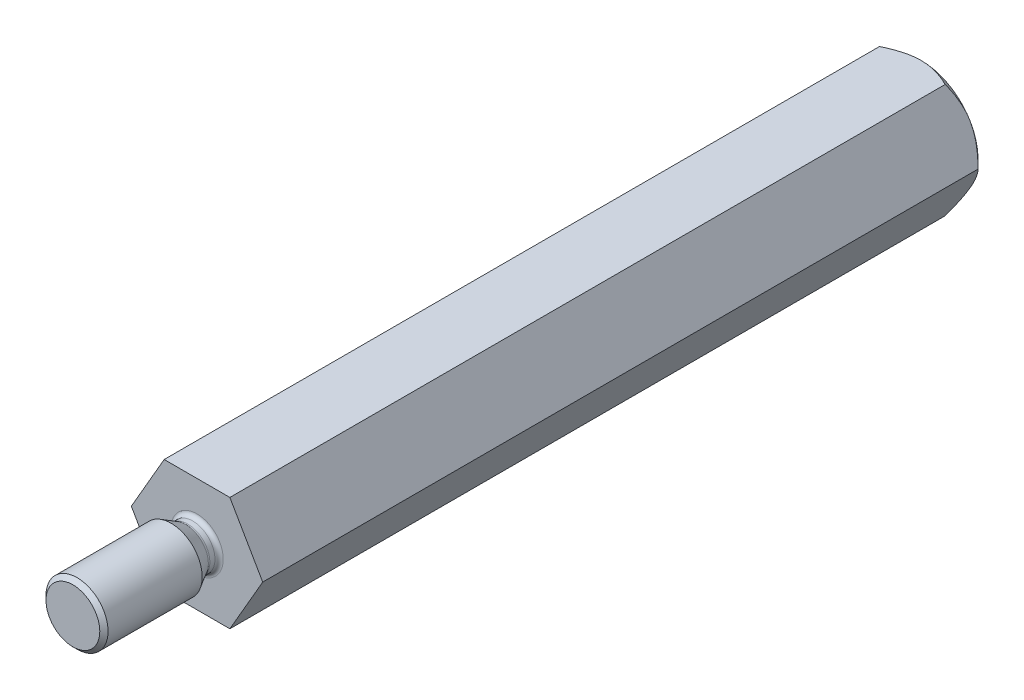
ISO-10303-21;
HEADER;
FILE_DESCRIPTION(('STEP AP214'),'2;1');
FILE_NAME('part.step','',(''),(''),'','','');
FILE_SCHEMA(('AUTOMOTIVE_DESIGN { 1 0 10303 214 1 1 1 1 }'));
ENDSEC;
DATA;
#1=APPLICATION_CONTEXT('core data for automotive mechanical design processes');
#2=APPLICATION_PROTOCOL_DEFINITION('international standard','automotive_design',2000,#1);
#3=PRODUCT_CONTEXT('',#1,'mechanical');
#4=PRODUCT('Part','Part','',(#3));
#5=PRODUCT_RELATED_PRODUCT_CATEGORY('part','',(#4));
#6=PRODUCT_DEFINITION_FORMATION('','',#4);
#7=PRODUCT_DEFINITION_CONTEXT('part definition',#1,'design');
#8=PRODUCT_DEFINITION('design','',#6,#7);
#9=PRODUCT_DEFINITION_SHAPE('','',#8);
#10=(LENGTH_UNIT() NAMED_UNIT(*) SI_UNIT(.MILLI.,.METRE.));
#11=(NAMED_UNIT(*) PLANE_ANGLE_UNIT() SI_UNIT($,.RADIAN.));
#12=(NAMED_UNIT(*) SI_UNIT($,.STERADIAN.) SOLID_ANGLE_UNIT());
#13=UNCERTAINTY_MEASURE_WITH_UNIT(LENGTH_MEASURE(1.E-05),#10,'distance_accuracy_value','');
#14=(GEOMETRIC_REPRESENTATION_CONTEXT(3) GLOBAL_UNCERTAINTY_ASSIGNED_CONTEXT((#13)) GLOBAL_UNIT_ASSIGNED_CONTEXT((#10,
#11,#12)) REPRESENTATION_CONTEXT('',''));
#15=CARTESIAN_POINT('',(0.,0.,0.));
#16=DIRECTION('',(0.,0.,1.));
#17=DIRECTION('',(1.,0.,0.));
#18=AXIS2_PLACEMENT_3D('',#15,#16,#17);
#19=CARTESIAN_POINT('',(0.,0.,0.));
#20=DIRECTION('',(0.,0.,-1.));
#21=DIRECTION('',(0.,1.,0.));
#22=AXIS2_PLACEMENT_3D('',#19,#20,#21);
#23=CYLINDRICAL_SURFACE('',#22,1.2295);
#24=CARTESIAN_POINT('',(0.,0.,7.75));
#25=DIRECTION('',(0.,0.,1.));
#26=DIRECTION('',(0.,-1.,0.));
#27=AXIS2_PLACEMENT_3D('',#24,#25,#26);
#28=CIRCLE('',#27,1.2295);
#29=CARTESIAN_POINT('',(0.,-1.2295,7.75));
#30=VERTEX_POINT('',#29);
#31=EDGE_CURVE('E10',#30,#30,#28,.T.);
#32=ORIENTED_EDGE('',*,*,#31,.T.);
#33=EDGE_LOOP('',(#32));
#34=FACE_BOUND('',#33,.T.);
#35=CARTESIAN_POINT('',(0.,0.,6.));
#36=DIRECTION('',(0.,0.,-1.));
#37=DIRECTION('',(0.,1.,0.));
#38=AXIS2_PLACEMENT_3D('',#35,#36,#37);
#39=CIRCLE('',#38,1.2295);
#40=CARTESIAN_POINT('',(0.,1.2295,6.));
#41=VERTEX_POINT('',#40);
#42=EDGE_CURVE('E427',#41,#41,#39,.T.);
#43=ORIENTED_EDGE('',*,*,#42,.T.);
#44=EDGE_LOOP('',(#43));
#45=FACE_BOUND('',#44,.T.);
#46=ADVANCED_FACE('F18',(#34,#45),#23,.F.);
#47=CARTESIAN_POINT('',(0.,0.,7.75));
#48=DIRECTION('',(0.,0.,-1.));
#49=DIRECTION('',(0.,-1.,0.));
#50=AXIS2_PLACEMENT_3D('',#47,#48,#49);
#51=CONICAL_SURFACE('',#50,1.2295,1.0297442587);
#52=CARTESIAN_POINT('',(0.,0.,8.48875813109439));
#53=VERTEX_POINT('',#52);
#54=VERTEX_LOOP('',#53);
#55=FACE_BOUND('',#54,.T.);
#56=ORIENTED_EDGE('',*,*,#31,.F.);
#57=EDGE_LOOP('',(#56));
#58=FACE_BOUND('',#57,.T.);
#59=ADVANCED_FACE('F227',(#55,#58),#51,.F.);
#60=CARTESIAN_POINT('',(0.,0.,0.));
#61=DIRECTION('',(0.,0.,1.));
#62=DIRECTION('',(1.,0.,0.));
#63=AXIS2_PLACEMENT_3D('',#60,#61,#62);
#64=CONICAL_SURFACE('',#63,2.75,0.7853981634);
#65=CARTESIAN_POINT('',(0.,2.74999999999999,0.));
#66=CARTESIAN_POINT('',(0.0341043571234106,2.74999861890424,-3.53259884093393E-06));
#67=CARTESIAN_POINT('',(0.0682091036572609,2.74997948805152,0.00061383270108054));
#68=CARTESIAN_POINT('',(0.136222772042681,2.74992704124477,0.0030907535110736));
#69=CARTESIAN_POINT('',(0.170131894168801,2.74989378822454,0.0049448184830641));
#70=CARTESIAN_POINT('',(0.237844442832217,2.7498340394499,0.00989433335030146));
#71=CARTESIAN_POINT('',(0.271647909325683,2.74980754072742,0.0129892364327693));
#72=CARTESIAN_POINT('',(0.3392383691755,2.74977175470888,0.0204142785426764));
#73=CARTESIAN_POINT('',(0.37302489074362,2.74976252798015,0.0247487031741273));
#74=CARTESIAN_POINT('',(0.440669470527523,2.74976449743803,0.034648382425125));
#75=CARTESIAN_POINT('',(0.474526240384504,2.74977584369463,0.0402224190062292));
#76=CARTESIAN_POINT('',(0.542397559938812,2.74981408590973,0.0525964834842523));
#77=CARTESIAN_POINT('',(0.576409776449452,2.7498411508128,0.0594092702256297));
#78=CARTESIAN_POINT('',(0.644675788165618,2.74990088521719,0.0742584686839939));
#79=CARTESIAN_POINT('',(0.678926068010077,2.74993362942729,0.0823110058625246));
#80=CARTESIAN_POINT('',(0.747749722500201,2.74998121217122,0.0996311567654862));
#81=CARTESIAN_POINT('',(0.782318367823815,2.74999572963724,0.108917454970508));
#82=CARTESIAN_POINT('',(0.88038601881697,2.75000789567393,0.136849886324606));
#83=CARTESIAN_POINT('',(0.943531372970484,2.74998076056158,0.156749287882284));
#84=CARTESIAN_POINT('',(1.07035799142403,2.74994607939209,0.200292896188396));
#85=CARTESIAN_POINT('',(1.13401003622385,2.74993906454919,0.224021474034921));
#86=CARTESIAN_POINT('',(1.26221097997681,2.74994419552998,0.275194073930808));
#87=CARTESIAN_POINT('',(1.32672126835582,2.74995697465818,0.30273413550954));
#88=CARTESIAN_POINT('',(1.45695845518261,2.74998345429518,0.361535002707917));
#89=CARTESIAN_POINT('',(1.52263992926524,2.74999717138164,0.392896758209248));
#90=CARTESIAN_POINT('',(1.58771324027201,2.75000000000094,0.425426480541856));
#91=B_SPLINE_CURVE_WITH_KNOTS('',3,(#65,#66,#67,#68,#69,#70,#71,#72,#73,#74,#75,#76,#77,#78,#79,
#80,#81,#82,#83,#84,#85,#86,#87,#88,#89,#90),.UNSPECIFIED.,.F.,.F.,(4,2,2,2,2,2,2,2,2,2,2,2,4),
(0.,0.102307924730991,0.204164632754111,0.305976503793407,0.408144732385636,0.51106122931164,
0.615104902454614,0.720638501056345,0.82800614213731,1.02652318717068,1.23023527842138,
1.44060096562512,1.65887448299112),.UNSPECIFIED.);
#92=CARTESIAN_POINT('',(0.,2.75,0.));
#93=VERTEX_POINT('',#92);
#94=CARTESIAN_POINT('',(1.58771324027147,2.75,0.425426480542942));
#95=VERTEX_POINT('',#94);
#96=EDGE_CURVE('E31',#93,#95,#91,.T.);
#97=ORIENTED_EDGE('',*,*,#96,.T.);
#98=CARTESIAN_POINT('',(1.58771324027201,2.75000000000094,0.425426480541856));
#99=CARTESIAN_POINT('',(1.62008586800597,2.69392339049336,0.393058204062984));
#100=CARTESIAN_POINT('',(1.65275098697914,2.63732022137532,0.361847181796044));
#101=CARTESIAN_POINT('',(1.71752728400933,2.52507576539604,0.303305250307223));
#102=CARTESIAN_POINT('',(1.74961610698012,2.46947314434643,0.275875140162084));
#103=CARTESIAN_POINT('',(1.81340593661073,2.35897829459429,0.224880281171958));
#104=CARTESIAN_POINT('',(1.84508742773007,2.30411867498551,0.201221133059118));
#105=CARTESIAN_POINT('',(1.90822991636142,2.1948183596994,0.157773926323874));
#106=CARTESIAN_POINT('',(1.93967609103449,2.14040238887509,0.137902837212986));
#107=CARTESIAN_POINT('',(1.98862479373585,2.05558994265301,0.10989160307812));
#108=CARTESIAN_POINT('',(2.00597445726904,2.02550760838335,0.100522102196332));
#109=CARTESIAN_POINT('',(2.04049982725193,1.96560802986883,0.0830470079238365));
#110=CARTESIAN_POINT('',(2.05767339779794,1.93579511697053,0.0749224578001094));
#111=CARTESIAN_POINT('',(2.09190765086211,1.8763772392239,0.0599405149224878));
#112=CARTESIAN_POINT('',(2.10896647167092,1.84677533612542,0.0530667616804423));
#113=CARTESIAN_POINT('',(2.14302133168703,1.78771318895903,0.0405820459154166));
#114=CARTESIAN_POINT('',(2.16001602971397,1.75825491575888,0.0349581401773121));
#115=CARTESIAN_POINT('',(2.19398939582868,1.69940861019537,0.0249699386505803));
#116=CARTESIAN_POINT('',(2.21096727434875,1.67002163636092,0.0205967426457484));
#117=CARTESIAN_POINT('',(2.24494766620327,1.6112403706075,0.0131053005786958));
#118=CARTESIAN_POINT('',(2.26194988688192,1.58184646199877,0.00998272896477727));
#119=CARTESIAN_POINT('',(2.29601421701902,1.52296849511368,0.00498895645114175));
#120=CARTESIAN_POINT('',(2.31307635101562,1.49348440075195,0.00311834856780006));
#121=CARTESIAN_POINT('',(2.34728757399125,1.43433659975544,0.000619260744209608));
#122=CARTESIAN_POINT('',(2.36443670891397,1.40467268171951,-3.59466212338939E-06));
#123=CARTESIAN_POINT('',(2.38156986040721,1.375,0.));
#124=B_SPLINE_CURVE_WITH_KNOTS('',3,(#98,#99,#100,#101,#102,#103,#104,#105,#106,#107,#108,#109,
#110,#111,#112,#113,#114,#115,#116,#117,#118,#119,#120,#121,#122,#123),.UNSPECIFIED.,.F.,.F.,(4,
2,2,2,2,2,2,2,2,2,2,2,4),(0.,0.217189030122969,0.426563730600506,0.629357035482391,
0.827001764290051,0.934892518546461,1.04092876657874,1.14545877933702,1.24884984070326,
1.35148572922666,1.45376349877162,1.55608967990091,1.65887609137924),.UNSPECIFIED.);
#125=CARTESIAN_POINT('',(2.38156986040721,1.375,0.));
#126=VERTEX_POINT('',#125);
#127=EDGE_CURVE('E210',#95,#126,#124,.T.);
#128=ORIENTED_EDGE('',*,*,#127,.T.);
#129=CARTESIAN_POINT('',(0.,0.,0.));
#130=DIRECTION('',(0.,0.,1.));
#131=DIRECTION('',(1.,0.,0.));
#132=AXIS2_PLACEMENT_3D('',#129,#130,#131);
#133=CIRCLE('',#132,2.75);
#134=EDGE_CURVE('E252',#126,#93,#133,.T.);
#135=ORIENTED_EDGE('',*,*,#134,.T.);
#136=EDGE_LOOP('',(#97,#128,#135));
#137=FACE_BOUND('',#136,.T.);
#138=ADVANCED_FACE('F216',(#137),#64,.T.);
#139=CARTESIAN_POINT('',(0.,0.,0.));
#140=DIRECTION('',(0.,0.,1.));
#141=DIRECTION('',(1.,0.,0.));
#142=AXIS2_PLACEMENT_3D('',#139,#140,#141);
#143=CONICAL_SURFACE('',#142,2.75,0.7853981634);
#144=CARTESIAN_POINT('',(-2.38156986040721,1.375,0.));
#145=CARTESIAN_POINT('',(-2.3587701382566,1.41447945468839,-1.22153108502762E-05));
#146=CARTESIAN_POINT('',(-2.33597714046333,1.45396028839581,0.00112915360157806));
#147=CARTESIAN_POINT('',(-2.29039506787166,1.53293198454752,0.00567076093027501));
#148=CARTESIAN_POINT('',(-2.26760615770305,1.57242260561894,0.0090768711158682));
#149=CARTESIAN_POINT('',(-2.22191787674868,1.65160295150279,0.0181436409500816));
#150=CARTESIAN_POINT('',(-2.19901963126139,1.69129080207738,0.0238261922889839));
#151=CARTESIAN_POINT('',(-2.15369008156117,1.76980324557651,0.0372216764164066));
#152=CARTESIAN_POINT('',(-2.1312568330197,1.80863199388174,0.0449038415829882));
#153=CARTESIAN_POINT('',(-2.08636665371297,1.88633954363466,0.0623381133748226));
#154=CARTESIAN_POINT('',(-2.06391168407863,1.92521504029784,0.0721099453570255));
#155=CARTESIAN_POINT('',(-2.01889398508229,2.00317483901239,0.0937129176361337));
#156=CARTESIAN_POINT('',(-1.99633496173605,2.04225306906253,0.105573574180578));
#157=CARTESIAN_POINT('',(-1.952719597376,2.11778416574946,0.130360168229342));
#158=CARTESIAN_POINT('',(-1.93164993735991,2.15426135611399,0.143189053963868));
#159=CARTESIAN_POINT('',(-1.8894156916827,2.22737399000462,0.170524944474476));
#160=CARTESIAN_POINT('',(-1.86825483660647,2.26400287901281,0.185055195179517));
#161=CARTESIAN_POINT('',(-1.82579307761486,2.33751948104257,0.215791986297255));
#162=CARTESIAN_POINT('',(-1.80449713488352,2.37439891762388,0.232025102056368));
#163=CARTESIAN_POINT('',(-1.76171409156785,2.4485062609397,0.266164305375059));
#164=CARTESIAN_POINT('',(-1.74023289125169,2.48572432856575,0.284099079256574));
#165=CARTESIAN_POINT('',(-1.69702887715559,2.56058857781309,0.321639329122189));
#166=CARTESIAN_POINT('',(-1.67531264867046,2.59822357790113,0.341274582645578));
#167=CARTESIAN_POINT('',(-1.63158754430788,2.67399316802039,0.382217805604433));
#168=CARTESIAN_POINT('',(-1.60958561963959,2.7121155154104,0.403555897886056));
#169=CARTESIAN_POINT('',(-1.58771324027188,2.7500000000009,0.425426480541754));
#170=B_SPLINE_CURVE_WITH_KNOTS('',3,(#144,#145,#146,#147,#148,#149,#150,#151,#152,#153,#154,
#155,#156,#157,#158,#159,#160,#161,#162,#163,#164,#165,#166,#167,#168,#169),.UNSPECIFIED.,.F.,
.F.,(4,2,2,2,2,2,2,2,2,2,2,2,4),(0.,0.136752183095005,0.273860311817051,0.412319886243657,
0.548763451211937,0.686556801911036,0.826481608036611,0.958558879233937,1.0927161517719,
1.22941898402345,1.36909205892603,1.5121192058478,1.65884444381443),.UNSPECIFIED.);
#171=CARTESIAN_POINT('',(-2.38156986040721,1.375,0.));
#172=VERTEX_POINT('',#171);
#173=CARTESIAN_POINT('',(-1.58771324027147,2.75,0.425426480542948));
#174=VERTEX_POINT('',#173);
#175=EDGE_CURVE('E284',#172,#174,#170,.T.);
#176=ORIENTED_EDGE('',*,*,#175,.T.);
#177=CARTESIAN_POINT('',(-1.5877132402721,2.75000000000081,0.425426480541791));
#178=CARTESIAN_POINT('',(-1.52274680583707,2.74999719062647,0.392950131769085));
#179=CARTESIAN_POINT('',(-1.45717404402976,2.74998414032401,0.361638468528981));
#180=CARTESIAN_POINT('',(-1.32714650365777,2.74995924648574,0.302922723236938));
#181=CARTESIAN_POINT('',(-1.26273685276344,2.74994737639063,0.275418368706052));
#182=CARTESIAN_POINT('',(-1.13473128050328,2.74994340877792,0.224302315982806));
#183=CARTESIAN_POINT('',(-1.07117372013472,2.74995069971573,0.200595235095971));
#184=CARTESIAN_POINT('',(-0.944532431674507,2.74998408800577,0.157079347250804));
#185=CARTESIAN_POINT('',(-0.88147774509121,2.75000970246999,0.137186748594892));
#186=CARTESIAN_POINT('',(-0.78345429420285,2.74999473760184,0.109227068924305));
#187=CARTESIAN_POINT('',(-0.7488375970628,2.7499790859136,0.0999142420422521));
#188=CARTESIAN_POINT('',(-0.679918082024509,2.74992983436984,0.0825447840863115));
#189=CARTESIAN_POINT('',(-0.64562001878538,2.74989654599886,0.0744693955234179));
#190=CARTESIAN_POINT('',(-0.577258430556596,2.74983607726749,0.059578030780006));
#191=CARTESIAN_POINT('',(-0.543198438244596,2.7498088172552,0.0527458730123368));
#192=CARTESIAN_POINT('',(-0.475231220546643,2.74977054571807,0.0403366407452526));
#193=CARTESIAN_POINT('',(-0.4413263387149,2.74975936133484,0.034746769050019));
#194=CARTESIAN_POINT('',(-0.373584850943819,2.74975797330821,0.0248189603510614));
#195=CARTESIAN_POINT('',(-0.339749537436798,2.74976761788161,0.0204722259754987));
#196=CARTESIAN_POINT('',(-0.272060451607915,2.74980437330618,0.0130260831007616));
#197=CARTESIAN_POINT('',(-0.238207150547322,2.74983142344698,0.00992239967315241));
#198=CARTESIAN_POINT('',(-0.170393521545398,2.74989223923677,0.0049588207782741));
#199=CARTESIAN_POINT('',(-0.136433150771531,2.7499260080368,0.00309951071117396));
#200=CARTESIAN_POINT('',(-0.0683151899237003,2.74997922706181,0.000615546109058398));
#201=CARTESIAN_POINT('',(-0.0341573968916376,2.74999861260068,-3.55173706823981E-06));
#202=CARTESIAN_POINT('',(0.,2.74999999999999,0.));
#203=B_SPLINE_CURVE_WITH_KNOTS('',3,(#177,#178,#179,#180,#181,#182,#183,#184,#185,#186,#187,
#188,#189,#190,#191,#192,#193,#194,#195,#196,#197,#198,#199,#200,#201,#202),.UNSPECIFIED.,.F.,
.F.,(4,2,2,2,2,2,2,2,2,2,2,2,4),(0.,0.217914918234821,0.427961192838665,0.631385638384192,
0.829637785774646,0.937165232623257,1.04285399402824,1.14704953750135,1.25011608037954,
1.35243410004178,1.45439715635164,1.55640814627561,1.65887517652018),.UNSPECIFIED.);
#204=EDGE_CURVE('E429',#174,#93,#203,.T.);
#205=ORIENTED_EDGE('',*,*,#204,.T.);
#206=CARTESIAN_POINT('',(0.,0.,0.));
#207=DIRECTION('',(0.,0.,1.));
#208=DIRECTION('',(1.,0.,0.));
#209=AXIS2_PLACEMENT_3D('',#206,#207,#208);
#210=CIRCLE('',#209,2.75);
#211=EDGE_CURVE('E866',#93,#172,#210,.T.);
#212=ORIENTED_EDGE('',*,*,#211,.T.);
#213=EDGE_LOOP('',(#176,#205,#212));
#214=FACE_BOUND('',#213,.T.);
#215=ADVANCED_FACE('F226',(#214),#143,.T.);
#216=CARTESIAN_POINT('',(0.,0.,0.));
#217=DIRECTION('',(0.,0.,1.));
#218=DIRECTION('',(1.,0.,0.));
#219=AXIS2_PLACEMENT_3D('',#216,#217,#218);
#220=CONICAL_SURFACE('',#219,2.75,0.7853981634);
#221=CARTESIAN_POINT('',(-2.38156986040721,-1.375,0.));
#222=CARTESIAN_POINT('',(-2.40436021001988,-1.33551513407372,-1.22153108279178E-05));
#223=CARTESIAN_POINT('',(-2.42715511607668,-1.29603540210216,0.00112915360157741));
#224=CARTESIAN_POINT('',(-2.47275557482834,-1.21707432120428,0.00567076093025359));
#225=CARTESIAN_POINT('',(-2.49556100080307,-1.17759323553797,0.00907687111582361));
#226=CARTESIAN_POINT('',(-2.54128905134152,-1.09843585063479,0.0181436409500827));
#227=CARTESIAN_POINT('',(-2.5642106154169,-1.05876146305391,0.0238261922890302));
#228=CARTESIAN_POINT('',(-2.60953961115117,-0.980248699720334,0.0372216764167855));
#229=CARTESIAN_POINT('',(-2.63194966931103,-0.941406562439408,0.0449038415837853));
#230=CARTESIAN_POINT('',(-2.67680129181049,-0.863676751900771,0.0623381133760528));
#231=CARTESIAN_POINT('',(-2.69924097468821,-0.824792429424501,0.0721099453581682));
#232=CARTESIAN_POINT('',(-2.74424729134959,-0.746826059118444,0.0937129176369096));
#233=CARTESIAN_POINT('',(-2.76681051963384,-0.70775025679306,0.105573574180982));
#234=CARTESIAN_POINT('',(-2.81041468596024,-0.63221269491979,0.130360168229899));
#235=CARTESIAN_POINT('',(-2.83147002946737,-0.595727238913744,0.143189053965079));
#236=CARTESIAN_POINT('',(-2.87367030491683,-0.522594992300971,0.170524944476681));
#237=CARTESIAN_POINT('',(-2.89481142577259,-0.485954709734477,0.185055195182045));
#238=CARTESIAN_POINT('',(-2.93724779123493,-0.412423446742665,0.215791986300237));
#239=CARTESIAN_POINT('',(-2.95853834882602,-0.375540901048882,0.232025102059464));
#240=CARTESIAN_POINT('',(-3.00132566908654,-0.301436027028244,0.266164305378156));
#241=CARTESIAN_POINT('',(-3.02281686097218,-0.264223728037744,0.284099079259542));
#242=CARTESIAN_POINT('',(-3.06604919560693,-0.189375829662009,0.321639329124682));
#243=CARTESIAN_POINT('',(-3.0877839475116,-0.151751524075981,0.341274582647709));
#244=CARTESIAN_POINT('',(-3.13153978520685,-0.0759996778567271,0.382217805605617));
#245=CARTESIAN_POINT('',(-3.15355374416371,-0.0378842784678013,0.403555897886641));
#246=CARTESIAN_POINT('',(-3.17542648054393,0.,0.425426480541759));
#247=B_SPLINE_CURVE_WITH_KNOTS('',3,(#221,#222,#223,#224,#225,#226,#227,#228,#229,#230,#231,
#232,#233,#234,#235,#236,#237,#238,#239,#240,#241,#242,#243,#244,#245,#246),.UNSPECIFIED.,.F.,
.F.,(4,2,2,2,2,2,2,2,2,2,2,2,4),(0.,0.136752183096545,0.273860311818587,0.412319886243655,
0.548763451218904,0.686556801918055,0.826481608036634,0.958558879237567,1.09271615177781,
1.22941898403021,1.36909205893213,1.51211920585164,1.65884444381436),.UNSPECIFIED.);
#248=CARTESIAN_POINT('',(-2.38156986040721,-1.375,0.));
#249=VERTEX_POINT('',#248);
#250=CARTESIAN_POINT('',(-3.17542648054295,0.,0.425426480542949));
#251=VERTEX_POINT('',#250);
#252=EDGE_CURVE('E371',#249,#251,#247,.T.);
#253=ORIENTED_EDGE('',*,*,#252,.T.);
#254=CARTESIAN_POINT('',(-3.17542648054403,0.,0.425426480541863));
#255=CARTESIAN_POINT('',(-3.14304902601974,0.0560738227579715,0.393058204063379));
#256=CARTESIAN_POINT('',(-3.11036180311584,0.112664230164765,0.361847181796851));
#257=CARTESIAN_POINT('',(-3.04554340131956,0.224884376944852,0.303305250308564));
#258=CARTESIAN_POINT('',(-3.0134345304592,0.280475423339762,0.275875140163569));
#259=CARTESIAN_POINT('',(-2.94963809840191,0.390966461179135,0.224880281173455));
#260=CARTESIAN_POINT('',(-2.91796901973832,0.445833247122906,0.201221133060508));
#261=CARTESIAN_POINT('',(-2.85488341437396,0.555166403979676,0.157773926324715));
#262=CARTESIAN_POINT('',(-2.82348088860453,0.609607575511088,0.137902837213413));
#263=CARTESIAN_POINT('',(-2.77450550696935,0.694404618643881,0.109891603078136));
#264=CARTESIAN_POINT('',(-2.75712827305339,0.724471035145112,0.10052210219633));
#265=CARTESIAN_POINT('',(-2.7225164013755,0.784320671881866,0.0830470079238204));
#266=CARTESIAN_POINT('',(-2.70528444671789,0.814099876697248,0.0749224578000993));
#267=CARTESIAN_POINT('',(-2.67094418168265,0.873456548403255,0.0599405149224806));
#268=CARTESIAN_POINT('',(-2.65383759200349,0.903030872131363,0.0530667616804356));
#269=CARTESIAN_POINT('',(-2.61971570216354,0.962054319610631,0.0405820459154086));
#270=CARTESIAN_POINT('',(-2.60270143823411,0.991501296431636,0.0349581401773063));
#271=CARTESIAN_POINT('',(-2.56872572575467,1.05034624732085,0.0249699386505745));
#272=CARTESIAN_POINT('',(-2.55176479913373,1.07974300833888,0.0205967426457446));
#273=CARTESIAN_POINT('',(-2.51784892565188,1.13856152379244,0.0131053005786917));
#274=CARTESIAN_POINT('',(-2.50089416441948,1.16798283312545,0.00998272896477544));
#275=CARTESIAN_POINT('',(-2.46693651444219,1.2269223918301,0.00498895645113976));
#276=CARTESIAN_POINT('',(-2.44993360671554,1.25644068049509,0.00311834856780038));
#277=CARTESIAN_POINT('',(-2.41581571996206,1.31564236918547,0.000619260744210046));
#278=CARTESIAN_POINT('',(-2.39870058082832,1.34532591469983,-3.59466212057722E-06));
#279=CARTESIAN_POINT('',(-2.38156986040721,1.375,0.));
#280=B_SPLINE_CURVE_WITH_KNOTS('',3,(#254,#255,#256,#257,#258,#259,#260,#261,#262,#263,#264,
#265,#266,#267,#268,#269,#270,#271,#272,#273,#274,#275,#276,#277,#278,#279),.UNSPECIFIED.,.F.,
.F.,(4,2,2,2,2,2,2,2,2,2,2,2,4),(0.,0.217189030120356,0.4265637305971,0.629357035479894,
0.827001764290007,0.934892518545138,1.0409287665765,1.14545877933422,1.24884984070027,
1.35148572922386,1.45376349876939,1.55608967989963,1.65887609137928),.UNSPECIFIED.);
#281=EDGE_CURVE('E955',#251,#172,#280,.T.);
#282=ORIENTED_EDGE('',*,*,#281,.T.);
#283=CARTESIAN_POINT('',(0.,0.,0.));
#284=DIRECTION('',(0.,0.,1.));
#285=DIRECTION('',(1.,0.,0.));
#286=AXIS2_PLACEMENT_3D('',#283,#284,#285);
#287=CIRCLE('',#286,2.75);
#288=EDGE_CURVE('E356',#172,#249,#287,.T.);
#289=ORIENTED_EDGE('',*,*,#288,.T.);
#290=EDGE_LOOP('',(#253,#282,#289));
#291=FACE_BOUND('',#290,.T.);
#292=ADVANCED_FACE('F266',(#291),#220,.T.);
#293=CARTESIAN_POINT('',(0.,0.,0.));
#294=DIRECTION('',(0.,0.,1.));
#295=DIRECTION('',(1.,0.,0.));
#296=AXIS2_PLACEMENT_3D('',#293,#294,#295);
#297=CONICAL_SURFACE('',#296,2.75,0.7853981634);
#298=CARTESIAN_POINT('',(1.58771324027202,-2.75000000000094,0.425426480541859));
#299=CARTESIAN_POINT('',(1.52264614616153,-2.74999718048917,0.392899849844633));
#300=CARTESIAN_POINT('',(1.45697081720779,-2.74998402396442,0.361541391439474));
#301=CARTESIAN_POINT('',(1.3267416602933,-2.74995892817957,0.302744790249351));
#302=CARTESIAN_POINT('',(1.26223317354668,-2.74994696210439,0.275205881811019));
#303=CARTESIAN_POINT('',(1.13403186900014,-2.74994298243558,0.224033380712369));
#304=CARTESIAN_POINT('',(1.0703775778393,-2.74995035096279,0.200303954964204));
#305=CARTESIAN_POINT('',(0.943543001317365,-2.74998393884662,0.156755958783764));
#306=CARTESIAN_POINT('',(0.880391854902072,-2.75000967386231,0.136853252743472));
#307=CARTESIAN_POINT('',(0.782321889451575,-2.74999476892171,0.108917536528079));
#308=CARTESIAN_POINT('',(0.747756809665774,-2.74997918415998,0.0996311007514721));
#309=CARTESIAN_POINT('',(0.678939230331542,-2.7499301775518,0.0823108420888695));
#310=CARTESIAN_POINT('',(0.644691455369976,-2.74989706448381,0.0742583553426798));
#311=CARTESIAN_POINT('',(0.576429464552148,-2.74983691602905,0.0594091829394985));
#312=CARTESIAN_POINT('',(0.542418758019754,-2.74980980157442,0.0525964002471827));
#313=CARTESIAN_POINT('',(0.474549452712475,-2.74977173812787,0.0402223274366126));
#314=CARTESIAN_POINT('',(0.440693181520041,-2.74976061762236,0.0346483095168507));
#315=CARTESIAN_POINT('',(0.373048597770343,-2.74975924565165,0.0247486315998937));
#316=CARTESIAN_POINT('',(0.339261568557502,-2.74976884364317,0.0204142237314116));
#317=CARTESIAN_POINT('',(0.271669089925182,-2.74980541096611,0.0129891809686735));
#318=CARTESIAN_POINT('',(0.237864108307821,-2.74983232010661,0.00989429651493924));
#319=CARTESIAN_POINT('',(0.170147525494973,-2.74989281524634,0.00494478167374837));
#320=CARTESIAN_POINT('',(0.136235881643648,-2.74992640437884,0.00309073509128043));
#321=CARTESIAN_POINT('',(0.0682161617320667,-2.74997933893641,0.0006138147907312));
#322=CARTESIAN_POINT('',(0.0341078840755696,-2.74999862017538,-3.53178646738477E-06));
#323=CARTESIAN_POINT('',(0.,-2.74999999999999,0.));
#324=B_SPLINE_CURVE_WITH_KNOTS('',3,(#298,#299,#300,#301,#302,#303,#304,#305,#306,#307,#308,
#309,#310,#311,#312,#313,#314,#315,#316,#317,#318,#319,#320,#321,#322,#323),.UNSPECIFIED.,.F.,
.F.,(4,2,2,2,2,2,2,2,2,2,2,2,4),(0.,0.2182526441871,0.428611997440191,0.632331341650845,
0.830867991803054,0.938225406453833,1.04375164296648,1.1477908668184,1.25070587118527,
1.35287560023214,1.45469199080435,1.55655625161738,1.65887476416637),.UNSPECIFIED.);
#325=CARTESIAN_POINT('',(1.58771324027147,-2.75,0.425426480542944));
#326=VERTEX_POINT('',#325);
#327=CARTESIAN_POINT('',(0.,-2.75,0.));
#328=VERTEX_POINT('',#327);
#329=EDGE_CURVE('E362',#326,#328,#324,.T.);
#330=ORIENTED_EDGE('',*,*,#329,.T.);
#331=CARTESIAN_POINT('',(0.,0.,0.));
#332=DIRECTION('',(0.,0.,1.));
#333=DIRECTION('',(1.,0.,0.));
#334=AXIS2_PLACEMENT_3D('',#331,#332,#333);
#335=CIRCLE('',#334,2.75);
#336=CARTESIAN_POINT('',(2.38156986040721,-1.375,0.));
#337=VERTEX_POINT('',#336);
#338=EDGE_CURVE('E348',#328,#337,#335,.T.);
#339=ORIENTED_EDGE('',*,*,#338,.T.);
#340=CARTESIAN_POINT('',(2.38156986040721,-1.375,0.));
#341=CARTESIAN_POINT('',(2.35877013825687,-1.41447945468793,-1.22153108481145E-05));
#342=CARTESIAN_POINT('',(2.33597714046389,-1.45396028839493,0.001129153601592));
#343=CARTESIAN_POINT('',(2.29039506787255,-1.53293198454622,0.00567076093028735));
#344=CARTESIAN_POINT('',(2.26760615770398,-1.57242260561765,0.00907687111589286));
#345=CARTESIAN_POINT('',(2.22191787674935,-1.65160295150195,0.0181436409501093));
#346=CARTESIAN_POINT('',(2.19901963126177,-1.69129080207697,0.0238261922890267));
#347=CARTESIAN_POINT('',(2.15369008156013,-1.76980324557808,0.037221676416571));
#348=CARTESIAN_POINT('',(2.13125683301754,-1.80863199388485,0.0449038415833239));
#349=CARTESIAN_POINT('',(2.08636665370953,-1.88633954363924,0.0623381133753467));
#350=CARTESIAN_POINT('',(2.06391168407504,-1.92521504030236,0.0721099453574849));
#351=CARTESIAN_POINT('',(2.01889398507977,-2.00317483901534,0.0937129176364542));
#352=CARTESIAN_POINT('',(1.99633496173476,-2.04225306906399,0.105573574180752));
#353=CARTESIAN_POINT('',(1.95271959737558,-2.11778416575092,0.130360168230113));
#354=CARTESIAN_POINT('',(1.93164993735915,-2.1542613561169,0.14318905396551));
#355=CARTESIAN_POINT('',(1.88941569168119,-2.22737399000982,0.170524944477455));
#356=CARTESIAN_POINT('',(1.86825483660454,-2.26400287901885,0.185055195182938));
#357=CARTESIAN_POINT('',(1.82579307761228,-2.33751948104972,0.215791986301293));
#358=CARTESIAN_POINT('',(1.8044971348807,-2.3743989176313,0.232025102060559));
#359=CARTESIAN_POINT('',(1.76171409156478,-2.44850626094707,0.26616430537925));
#360=CARTESIAN_POINT('',(1.7402328912486,-2.48572432857282,0.284099079260591));
#361=CARTESIAN_POINT('',(1.69702887715278,-2.56058857781898,0.321639329125562));
#362=CARTESIAN_POINT('',(1.67531264866795,-2.59822357790617,0.341274582648461));
#363=CARTESIAN_POINT('',(1.63158754430639,-2.67399316802315,0.382217805606032));
#364=CARTESIAN_POINT('',(1.60958561963881,-2.71211551541176,0.403555897886843));
#365=CARTESIAN_POINT('',(1.58771324027188,-2.7500000000009,0.425426480541754));
#366=B_SPLINE_CURVE_WITH_KNOTS('',3,(#340,#341,#342,#343,#344,#345,#346,#347,#348,#349,#350,
#351,#352,#353,#354,#355,#356,#357,#358,#359,#360,#361,#362,#363,#364,#365),.UNSPECIFIED.,.F.,
.F.,(4,2,2,2,2,2,2,2,2,2,2,2,4),(0.,0.13675218309344,0.27386031181548,0.412319886243632,
0.548763451217609,0.686556801916739,0.826481608036652,0.95855887923886,1.09271615177991,
1.22941898403262,1.36909205893429,1.51211920585301,1.65884444381434),.UNSPECIFIED.);
#367=EDGE_CURVE('E187',#337,#326,#366,.T.);
#368=ORIENTED_EDGE('',*,*,#367,.T.);
#369=EDGE_LOOP('',(#330,#339,#368));
#370=FACE_BOUND('',#369,.T.);
#371=ADVANCED_FACE('F306',(#370),#297,.T.);
#372=CARTESIAN_POINT('',(0.,0.,0.));
#373=DIRECTION('',(0.,0.,1.));
#374=DIRECTION('',(1.,0.,0.));
#375=AXIS2_PLACEMENT_3D('',#372,#373,#374);
#376=CONICAL_SURFACE('',#375,2.75,0.7853981634);
#377=CARTESIAN_POINT('',(3.17542648054403,0.,0.425426480541856));
#378=CARTESIAN_POINT('',(3.1430490260213,-0.0560738227552683,0.393058204064924));
#379=CARTESIAN_POINT('',(3.11036180311918,-0.112664230159533,0.361847181800051));
#380=CARTESIAN_POINT('',(3.04554340132552,-0.224884376936479,0.303305250313904));
#381=CARTESIAN_POINT('',(3.01343453046596,-0.280475423330809,0.275875140169487));
#382=CARTESIAN_POINT('',(2.94963809840908,-0.39096646117063,0.224880281179423));
#383=CARTESIAN_POINT('',(2.91796901974508,-0.445833247115467,0.201221133066051));
#384=CARTESIAN_POINT('',(2.85488341437825,-0.555166403975424,0.157773926328057));
#385=CARTESIAN_POINT('',(2.82348088860676,-0.609607575509004,0.137902837215097));
#386=CARTESIAN_POINT('',(2.77450550696981,-0.694404618642117,0.109891603078174));
#387=CARTESIAN_POINT('',(2.75712827305428,-0.724471035141529,0.100522102196299));
#388=CARTESIAN_POINT('',(2.72251640137729,-0.784320671875285,0.0830470079237357));
#389=CARTESIAN_POINT('',(2.70528444672015,-0.814099876689487,0.0749224578000404));
#390=CARTESIAN_POINT('',(2.67094418168573,-0.873456548393644,0.0599405149224353));
#391=CARTESIAN_POINT('',(2.65383759200693,-0.903030872121083,0.0530667616803924));
#392=CARTESIAN_POINT('',(2.61971570216756,-0.962054319599519,0.0405820459153615));
#393=CARTESIAN_POINT('',(2.60270143823836,-0.991501296420364,0.0349581401772687));
#394=CARTESIAN_POINT('',(2.56872572575918,-1.05034624730972,0.0249699386505378));
#395=CARTESIAN_POINT('',(2.55176479913828,-1.07974300832808,0.0205967426457165));
#396=CARTESIAN_POINT('',(2.51784892565626,-1.13856152378271,0.0131053005786635));
#397=CARTESIAN_POINT('',(2.50089416442366,-1.16798283311648,0.00998272896475667));
#398=CARTESIAN_POINT('',(2.46693651444569,-1.22692239182307,0.00498895645112119));
#399=CARTESIAN_POINT('',(2.44993360671855,-1.25644068048924,0.00311834856779107));
#400=CARTESIAN_POINT('',(2.41581571996377,-1.31564236918237,0.000619260744200908));
#401=CARTESIAN_POINT('',(2.39870058082921,-1.3453259146983,-3.59466212031157E-06));
#402=CARTESIAN_POINT('',(2.38156986040721,-1.375,0.));
#403=B_SPLINE_CURVE_WITH_KNOTS('',3,(#377,#378,#379,#380,#381,#382,#383,#384,#385,#386,#387,
#388,#389,#390,#391,#392,#393,#394,#395,#396,#397,#398,#399,#400,#401,#402),.UNSPECIFIED.,.F.,
.F.,(4,2,2,2,2,2,2,2,2,2,2,2,4),(0.,0.217189030109888,0.426563730583455,0.629357035469891,
0.827001764289844,0.934892518539845,1.04092876656751,1.145458779323,1.24884984068831,
1.35148572921264,1.45376349876044,1.55608967989446,1.65887609137942),.UNSPECIFIED.);
#404=CARTESIAN_POINT('',(3.17542648054294,0.,0.425426480542942));
#405=VERTEX_POINT('',#404);
#406=EDGE_CURVE('E192',#405,#337,#403,.T.);
#407=ORIENTED_EDGE('',*,*,#406,.T.);
#408=CARTESIAN_POINT('',(0.,0.,0.));
#409=DIRECTION('',(0.,0.,1.));
#410=DIRECTION('',(1.,0.,0.));
#411=AXIS2_PLACEMENT_3D('',#408,#409,#410);
#412=CIRCLE('',#411,2.75);
#413=EDGE_CURVE('E357',#337,#126,#412,.T.);
#414=ORIENTED_EDGE('',*,*,#413,.T.);
#415=CARTESIAN_POINT('',(2.38156986040721,1.375,0.));
#416=CARTESIAN_POINT('',(2.4043602100199,1.33551513407368,-1.22153108307086E-05));
#417=CARTESIAN_POINT('',(2.42715511607673,1.29603540210207,0.00112915360157253));
#418=CARTESIAN_POINT('',(2.47275557482841,1.21707432120413,0.00567076093024673));
#419=CARTESIAN_POINT('',(2.49556100080313,1.17759323553782,0.00907687111581419));
#420=CARTESIAN_POINT('',(2.54128905134155,1.09843585063469,0.0181436409500741));
#421=CARTESIAN_POINT('',(2.56421061541691,1.05876146305386,0.0238261922890225));
#422=CARTESIAN_POINT('',(2.6095396111512,0.980248699720275,0.0372216764167917));
#423=CARTESIAN_POINT('',(2.6319496693111,0.941406562439294,0.0449038415838102));
#424=CARTESIAN_POINT('',(2.67680129181059,0.863676751900598,0.0623381133760965));
#425=CARTESIAN_POINT('',(2.69924097468831,0.824792429424323,0.0721099453582092));
#426=CARTESIAN_POINT('',(2.74424729134965,0.746826059118319,0.0937129176369336));
#427=CARTESIAN_POINT('',(2.76681051963386,0.707750256792991,0.105573574180989));
#428=CARTESIAN_POINT('',(2.81041468596023,0.632212694919784,0.130360168229891));
#429=CARTESIAN_POINT('',(2.83147002946736,0.595727238913745,0.143189053965075));
#430=CARTESIAN_POINT('',(2.87367030491683,0.522594992300983,0.170524944476683));
#431=CARTESIAN_POINT('',(2.89481142577259,0.485954709734494,0.185055195182048));
#432=CARTESIAN_POINT('',(2.93724779123493,0.412423446742691,0.215791986300242));
#433=CARTESIAN_POINT('',(2.95853834882602,0.375540901048914,0.23202510205947));
#434=CARTESIAN_POINT('',(3.00132566908654,0.301436027028287,0.266164305378161));
#435=CARTESIAN_POINT('',(3.02281686097218,0.264223728037792,0.284099079259547));
#436=CARTESIAN_POINT('',(3.06604919560693,0.189375829662068,0.321639329124684));
#437=CARTESIAN_POINT('',(3.0877839475116,0.151751524076046,0.34127458264771));
#438=CARTESIAN_POINT('',(3.13153978520684,0.0759996778568041,0.382217805605614));
#439=CARTESIAN_POINT('',(3.15355374416371,0.0378842784678845,0.403555897886635));
#440=CARTESIAN_POINT('',(3.17542648054392,0.,0.425426480541749));
#441=B_SPLINE_CURVE_WITH_KNOTS('',3,(#415,#416,#417,#418,#419,#420,#421,#422,#423,#424,#425,
#426,#427,#428,#429,#430,#431,#432,#433,#434,#435,#436,#437,#438,#439,#440),.UNSPECIFIED.,.F.,
.F.,(4,2,2,2,2,2,2,2,2,2,2,2,4),(0.,0.136752183096705,0.273860311818748,0.412319886243658,
0.548763451219112,0.686556801918269,0.826481608036641,0.958558879237566,1.0927161517778,
1.22941898403019,1.36909205893209,1.51211920585159,1.65884444381428),.UNSPECIFIED.);
#442=EDGE_CURVE('E176',#126,#405,#441,.T.);
#443=ORIENTED_EDGE('',*,*,#442,.T.);
#444=EDGE_LOOP('',(#407,#414,#443));
#445=FACE_BOUND('',#444,.T.);
#446=ADVANCED_FACE('F295',(#445),#376,.T.);
#447=CARTESIAN_POINT('',(0.,0.,40.8));
#448=DIRECTION('',(0.,0.,-1.));
#449=DIRECTION('',(-1.,0.,0.));
#450=AXIS2_PLACEMENT_3D('',#447,#448,#449);
#451=CONICAL_SURFACE('',#450,1.5,0.7853981634);
#452=CARTESIAN_POINT('',(0.,0.,41.));
#453=DIRECTION('',(0.,0.,1.));
#454=DIRECTION('',(1.,0.,0.));
#455=AXIS2_PLACEMENT_3D('',#452,#453,#454);
#456=CIRCLE('',#455,1.3);
#457=CARTESIAN_POINT('',(1.30000000000009,0.,41.));
#458=VERTEX_POINT('',#457);
#459=EDGE_CURVE('E406',#458,#458,#456,.T.);
#460=ORIENTED_EDGE('',*,*,#459,.F.);
#461=EDGE_LOOP('',(#460));
#462=FACE_BOUND('',#461,.T.);
#463=CARTESIAN_POINT('',(0.,0.,40.8));
#464=DIRECTION('',(0.,0.,-1.));
#465=DIRECTION('',(1.,0.,0.));
#466=AXIS2_PLACEMENT_3D('',#463,#464,#465);
#467=CIRCLE('',#466,1.5);
#468=CARTESIAN_POINT('',(1.5000000000001,0.,40.8));
#469=VERTEX_POINT('',#468);
#470=EDGE_CURVE('E130',#469,#469,#467,.T.);
#471=ORIENTED_EDGE('',*,*,#470,.F.);
#472=EDGE_LOOP('',(#471));
#473=FACE_BOUND('',#472,.T.);
#474=ADVANCED_FACE('F305',(#462,#473),#451,.T.);
#475=CARTESIAN_POINT('',(0.,0.,35.4464101615138));
#476=DIRECTION('',(0.,0.,-1.));
#477=DIRECTION('',(-1.,0.,0.));
#478=AXIS2_PLACEMENT_3D('',#475,#476,#477);
#479=TOROIDAL_SURFACE('',#478,1.2669872981,0.2);
#480=CARTESIAN_POINT('',(0.,0.,35.5464101615138));
#481=DIRECTION('',(0.,0.,1.));
#482=DIRECTION('',(1.,0.,0.));
#483=AXIS2_PLACEMENT_3D('',#480,#481,#482);
#484=CIRCLE('',#483,1.0937822174);
#485=CARTESIAN_POINT('',(1.09378221735097,0.,35.5464101615138));
#486=VERTEX_POINT('',#485);
#487=EDGE_CURVE('E140',#486,#486,#484,.T.);
#488=ORIENTED_EDGE('',*,*,#487,.F.);
#489=EDGE_LOOP('',(#488));
#490=FACE_BOUND('',#489,.T.);
#491=CARTESIAN_POINT('',(0.,0.,35.4464101615138));
#492=DIRECTION('',(0.,0.,-1.));
#493=DIRECTION('',(-1.,0.,0.));
#494=AXIS2_PLACEMENT_3D('',#491,#492,#493);
#495=CIRCLE('',#494,1.0669872981);
#496=CARTESIAN_POINT('',(-1.06698729810778,0.,35.4464101615138));
#497=VERTEX_POINT('',#496);
#498=EDGE_CURVE('E403',#497,#497,#495,.T.);
#499=ORIENTED_EDGE('',*,*,#498,.F.);
#500=EDGE_LOOP('',(#499));
#501=FACE_BOUND('',#500,.T.);
#502=ADVANCED_FACE('F20',(#490,#501),#479,.F.);
#503=CARTESIAN_POINT('',(0.,0.,35.2));
#504=DIRECTION('',(0.,0.,1.));
#505=DIRECTION('',(1.,0.,0.));
#506=AXIS2_PLACEMENT_3D('',#503,#504,#505);
#507=TOROIDAL_SURFACE('',#506,1.2669872981,0.2);
#508=CARTESIAN_POINT('',(0.,0.,35.));
#509=DIRECTION('',(0.,0.,-1.));
#510=DIRECTION('',(1.,0.,0.));
#511=AXIS2_PLACEMENT_3D('',#508,#509,#510);
#512=CIRCLE('',#511,1.2669872981);
#513=CARTESIAN_POINT('',(1.26698729810786,0.,35.));
#514=VERTEX_POINT('',#513);
#515=EDGE_CURVE('E398',#514,#514,#512,.T.);
#516=ORIENTED_EDGE('',*,*,#515,.F.);
#517=EDGE_LOOP('',(#516));
#518=FACE_BOUND('',#517,.T.);
#519=CARTESIAN_POINT('',(0.,0.,35.2));
#520=DIRECTION('',(0.,0.,1.));
#521=DIRECTION('',(1.,0.,0.));
#522=AXIS2_PLACEMENT_3D('',#519,#520,#521);
#523=CIRCLE('',#522,1.0669872981);
#524=CARTESIAN_POINT('',(1.06698729810786,0.,35.2));
#525=VERTEX_POINT('',#524);
#526=EDGE_CURVE('E412',#525,#525,#523,.T.);
#527=ORIENTED_EDGE('',*,*,#526,.F.);
#528=EDGE_LOOP('',(#527));
#529=FACE_BOUND('',#528,.T.);
#530=ADVANCED_FACE('F228',(#518,#529),#507,.F.);
#531=CARTESIAN_POINT('',(1.58771324027147,2.75,35.));
#532=DIRECTION('',(0.,-1.,0.));
#533=DIRECTION('',(-1.,0.,0.));
#534=AXIS2_PLACEMENT_3D('',#531,#532,#533);
#535=PLANE('',#534);
#536=ORIENTED_EDGE('',*,*,#204,.F.);
#537=DIRECTION('',(0.,0.,-1.));
#538=VECTOR('',#537,1.);
#539=CARTESIAN_POINT('',(-1.58771324027147,2.75,35.));
#540=LINE('',#539,#538);
#541=CARTESIAN_POINT('',(-1.58771324027147,2.75,35.));
#542=VERTEX_POINT('',#541);
#543=EDGE_CURVE('E275',#542,#174,#540,.T.);
#544=ORIENTED_EDGE('',*,*,#543,.F.);
#545=DIRECTION('',(-1.,0.,0.));
#546=VECTOR('',#545,1.);
#547=CARTESIAN_POINT('',(1.58771324027147,2.75,35.));
#548=LINE('',#547,#546);
#549=CARTESIAN_POINT('',(1.58771324027147,2.75,35.));
#550=VERTEX_POINT('',#549);
#551=EDGE_CURVE('E395',#550,#542,#548,.T.);
#552=ORIENTED_EDGE('',*,*,#551,.F.);
#553=DIRECTION('',(0.,0.,-1.));
#554=VECTOR('',#553,1.);
#555=CARTESIAN_POINT('',(1.58771324027147,2.75,35.));
#556=LINE('',#555,#554);
#557=EDGE_CURVE('E173',#550,#95,#556,.T.);
#558=ORIENTED_EDGE('',*,*,#557,.T.);
#559=ORIENTED_EDGE('',*,*,#96,.F.);
#560=EDGE_LOOP('',(#536,#544,#552,#558,#559));
#561=FACE_BOUND('',#560,.T.);
#562=ADVANCED_FACE('F254',(#561),#535,.F.);
#563=CARTESIAN_POINT('',(0.,0.,0.));
#564=DIRECTION('',(0.,0.,-1.));
#565=DIRECTION('',(1.,0.,0.));
#566=AXIS2_PLACEMENT_3D('',#563,#564,#565);
#567=CONICAL_SURFACE('',#566,1.4295,0.7853981634);
#568=CARTESIAN_POINT('',(0.,0.,0.2));
#569=DIRECTION('',(0.,0.,-1.));
#570=DIRECTION('',(-1.,0.,0.));
#571=AXIS2_PLACEMENT_3D('',#568,#569,#570);
#572=CIRCLE('',#571,1.2295);
#573=CARTESIAN_POINT('',(-1.2295,0.,0.2));
#574=VERTEX_POINT('',#573);
#575=EDGE_CURVE('E409',#574,#574,#572,.T.);
#576=ORIENTED_EDGE('',*,*,#575,.F.);
#577=EDGE_LOOP('',(#576));
#578=FACE_BOUND('',#577,.T.);
#579=CARTESIAN_POINT('',(0.,0.,0.));
#580=DIRECTION('',(0.,0.,1.));
#581=DIRECTION('',(1.,0.,0.));
#582=AXIS2_PLACEMENT_3D('',#579,#580,#581);
#583=CIRCLE('',#582,1.4295);
#584=CARTESIAN_POINT('',(1.4295,0.,0.));
#585=VERTEX_POINT('',#584);
#586=EDGE_CURVE('E399',#585,#585,#583,.T.);
#587=ORIENTED_EDGE('',*,*,#586,.F.);
#588=EDGE_LOOP('',(#587));
#589=FACE_BOUND('',#588,.T.);
#590=ADVANCED_FACE('F263',(#578,#589),#567,.F.);
#591=CARTESIAN_POINT('',(0.,0.,0.));
#592=DIRECTION('',(0.,0.,-1.));
#593=DIRECTION('',(0.,1.,0.));
#594=AXIS2_PLACEMENT_3D('',#591,#592,#593);
#595=CYLINDRICAL_SURFACE('',#594,1.2295);
#596=ORIENTED_EDGE('',*,*,#42,.F.);
#597=EDGE_LOOP('',(#596));
#598=FACE_BOUND('',#597,.T.);
#599=ORIENTED_EDGE('',*,*,#575,.T.);
#600=EDGE_LOOP('',(#599));
#601=FACE_BOUND('',#600,.T.);
#602=ADVANCED_FACE('F523',(#598,#601),#595,.F.);
#603=CARTESIAN_POINT('',(-1.5,0.,41.));
#604=DIRECTION('',(0.,0.,1.));
#605=DIRECTION('',(1.,0.,0.));
#606=AXIS2_PLACEMENT_3D('',#603,#604,#605);
#607=PLANE('',#606);
#608=ORIENTED_EDGE('',*,*,#459,.T.);
#609=EDGE_LOOP('',(#608));
#610=FACE_BOUND('',#609,.T.);
#611=ADVANCED_FACE('F525',(#610),#607,.T.);
#612=CARTESIAN_POINT('',(0.,0.,11.));
#613=DIRECTION('',(0.,0.,1.));
#614=DIRECTION('',(-1.,0.,0.));
#615=AXIS2_PLACEMENT_3D('',#612,#613,#614);
#616=CYLINDRICAL_SURFACE('',#615,1.5);
#617=ORIENTED_EDGE('',*,*,#470,.T.);
#618=EDGE_LOOP('',(#617));
#619=FACE_BOUND('',#618,.T.);
#620=CARTESIAN_POINT('',(0.,0.,36.25));
#621=DIRECTION('',(0.,0.,-1.));
#622=DIRECTION('',(-1.,0.,0.));
#623=AXIS2_PLACEMENT_3D('',#620,#621,#622);
#624=CIRCLE('',#623,1.5);
#625=CARTESIAN_POINT('',(-1.5,0.,36.25));
#626=VERTEX_POINT('',#625);
#627=EDGE_CURVE('E400',#626,#626,#624,.T.);
#628=ORIENTED_EDGE('',*,*,#627,.F.);
#629=EDGE_LOOP('',(#628));
#630=FACE_BOUND('',#629,.T.);
#631=ADVANCED_FACE('F528',(#619,#630),#616,.T.);
#632=CARTESIAN_POINT('',(0.,0.,35.5));
#633=DIRECTION('',(0.,0.,1.));
#634=DIRECTION('',(1.,0.,0.));
#635=AXIS2_PLACEMENT_3D('',#632,#633,#634);
#636=CONICAL_SURFACE('',#635,1.0669872981,0.5235987756);
#637=ORIENTED_EDGE('',*,*,#487,.T.);
#638=EDGE_LOOP('',(#637));
#639=FACE_BOUND('',#638,.T.);
#640=ORIENTED_EDGE('',*,*,#627,.T.);
#641=EDGE_LOOP('',(#640));
#642=FACE_BOUND('',#641,.T.);
#643=ADVANCED_FACE('F606',(#639,#642),#636,.T.);
#644=CARTESIAN_POINT('',(0.,0.,11.));
#645=DIRECTION('',(0.,0.,1.));
#646=DIRECTION('',(-1.,0.,0.));
#647=AXIS2_PLACEMENT_3D('',#644,#645,#646);
#648=CYLINDRICAL_SURFACE('',#647,1.0669872981);
#649=ORIENTED_EDGE('',*,*,#498,.T.);
#650=EDGE_LOOP('',(#649));
#651=FACE_BOUND('',#650,.T.);
#652=ORIENTED_EDGE('',*,*,#526,.T.);
#653=EDGE_LOOP('',(#652));
#654=FACE_BOUND('',#653,.T.);
#655=ADVANCED_FACE('F307',(#651,#654),#648,.T.);
#656=CARTESIAN_POINT('',(0.,0.,35.));
#657=DIRECTION('',(0.,0.,1.));
#658=DIRECTION('',(1.,0.,0.));
#659=AXIS2_PLACEMENT_3D('',#656,#657,#658);
#660=PLANE('',#659);
#661=ORIENTED_EDGE('',*,*,#515,.T.);
#662=EDGE_LOOP('',(#661));
#663=FACE_BOUND('',#662,.T.);
#664=ORIENTED_EDGE('',*,*,#551,.T.);
#665=DIRECTION('',(-0.5,-0.866025403784439,0.));
#666=VECTOR('',#665,1.);
#667=CARTESIAN_POINT('',(-1.58771324027147,2.75,35.));
#668=LINE('',#667,#666);
#669=CARTESIAN_POINT('',(-3.17542648054295,0.,35.));
#670=VERTEX_POINT('',#669);
#671=EDGE_CURVE('E285',#542,#670,#668,.T.);
#672=ORIENTED_EDGE('',*,*,#671,.T.);
#673=DIRECTION('',(0.5,-0.866025403784439,0.));
#674=VECTOR('',#673,1.);
#675=CARTESIAN_POINT('',(-3.17542648054295,0.,35.));
#676=LINE('',#675,#674);
#677=CARTESIAN_POINT('',(-1.58771324027147,-2.75,35.));
#678=VERTEX_POINT('',#677);
#679=EDGE_CURVE('E377',#670,#678,#676,.T.);
#680=ORIENTED_EDGE('',*,*,#679,.T.);
#681=DIRECTION('',(1.,0.,0.));
#682=VECTOR('',#681,1.);
#683=CARTESIAN_POINT('',(-1.58771324027147,-2.75,35.));
#684=LINE('',#683,#682);
#685=CARTESIAN_POINT('',(1.58771324027147,-2.75,35.));
#686=VERTEX_POINT('',#685);
#687=EDGE_CURVE('E182',#678,#686,#684,.T.);
#688=ORIENTED_EDGE('',*,*,#687,.T.);
#689=DIRECTION('',(0.5,0.866025403784439,0.));
#690=VECTOR('',#689,1.);
#691=CARTESIAN_POINT('',(1.58771324027147,-2.75,35.));
#692=LINE('',#691,#690);
#693=CARTESIAN_POINT('',(3.17542648054294,0.,35.));
#694=VERTEX_POINT('',#693);
#695=EDGE_CURVE('E179',#686,#694,#692,.T.);
#696=ORIENTED_EDGE('',*,*,#695,.T.);
#697=DIRECTION('',(-0.5,0.866025403784439,0.));
#698=VECTOR('',#697,1.);
#699=CARTESIAN_POINT('',(3.17542648054294,0.,35.));
#700=LINE('',#699,#698);
#701=EDGE_CURVE('E164',#694,#550,#700,.T.);
#702=ORIENTED_EDGE('',*,*,#701,.T.);
#703=EDGE_LOOP('',(#664,#672,#680,#688,#696,#702));
#704=FACE_BOUND('',#703,.T.);
#705=ADVANCED_FACE('F180',(#663,#704),#660,.T.);
#706=CARTESIAN_POINT('',(0.,0.,0.));
#707=DIRECTION('',(0.,0.,1.));
#708=DIRECTION('',(1.,0.,0.));
#709=AXIS2_PLACEMENT_3D('',#706,#707,#708);
#710=PLANE('',#709);
#711=ORIENTED_EDGE('',*,*,#586,.T.);
#712=EDGE_LOOP('',(#711));
#713=FACE_BOUND('',#712,.T.);
#714=ORIENTED_EDGE('',*,*,#211,.F.);
#715=ORIENTED_EDGE('',*,*,#134,.F.);
#716=ORIENTED_EDGE('',*,*,#413,.F.);
#717=ORIENTED_EDGE('',*,*,#338,.F.);
#718=CARTESIAN_POINT('',(0.,0.,0.));
#719=DIRECTION('',(0.,0.,1.));
#720=DIRECTION('',(1.,0.,0.));
#721=AXIS2_PLACEMENT_3D('',#718,#719,#720);
#722=CIRCLE('',#721,2.75);
#723=EDGE_CURVE('E484',#249,#328,#722,.T.);
#724=ORIENTED_EDGE('',*,*,#723,.F.);
#725=ORIENTED_EDGE('',*,*,#288,.F.);
#726=EDGE_LOOP('',(#714,#715,#716,#717,#724,#725));
#727=FACE_BOUND('',#726,.T.);
#728=ADVANCED_FACE('F340',(#713,#727),#710,.F.);
#729=CARTESIAN_POINT('',(3.17542648054294,0.,35.));
#730=DIRECTION('',(-0.866025403784439,-0.5,0.));
#731=DIRECTION('',(-0.5,0.866025403784439,0.));
#732=AXIS2_PLACEMENT_3D('',#729,#730,#731);
#733=PLANE('',#732);
#734=ORIENTED_EDGE('',*,*,#127,.F.);
#735=ORIENTED_EDGE('',*,*,#557,.F.);
#736=ORIENTED_EDGE('',*,*,#701,.F.);
#737=DIRECTION('',(0.,0.,-1.));
#738=VECTOR('',#737,1.);
#739=CARTESIAN_POINT('',(3.17542648054294,0.,35.));
#740=LINE('',#739,#738);
#741=EDGE_CURVE('E170',#694,#405,#740,.T.);
#742=ORIENTED_EDGE('',*,*,#741,.T.);
#743=ORIENTED_EDGE('',*,*,#442,.F.);
#744=EDGE_LOOP('',(#734,#735,#736,#742,#743));
#745=FACE_BOUND('',#744,.T.);
#746=ADVANCED_FACE('F167',(#745),#733,.F.);
#747=CARTESIAN_POINT('',(1.58771324027147,-2.75,35.));
#748=DIRECTION('',(-0.866025403784439,0.5,0.));
#749=DIRECTION('',(0.,0.,1.));
#750=AXIS2_PLACEMENT_3D('',#747,#748,#749);
#751=PLANE('',#750);
#752=ORIENTED_EDGE('',*,*,#406,.F.);
#753=ORIENTED_EDGE('',*,*,#741,.F.);
#754=ORIENTED_EDGE('',*,*,#695,.F.);
#755=DIRECTION('',(0.,0.,-1.));
#756=VECTOR('',#755,1.);
#757=CARTESIAN_POINT('',(1.58771324027147,-2.75,35.));
#758=LINE('',#757,#756);
#759=EDGE_CURVE('E360',#686,#326,#758,.T.);
#760=ORIENTED_EDGE('',*,*,#759,.T.);
#761=ORIENTED_EDGE('',*,*,#367,.F.);
#762=EDGE_LOOP('',(#752,#753,#754,#760,#761));
#763=FACE_BOUND('',#762,.T.);
#764=ADVANCED_FACE('F189',(#763),#751,.F.);
#765=CARTESIAN_POINT('',(-1.58771324027147,-2.75,35.));
#766=DIRECTION('',(0.,1.,0.));
#767=DIRECTION('',(1.,0.,0.));
#768=AXIS2_PLACEMENT_3D('',#765,#766,#767);
#769=PLANE('',#768);
#770=ORIENTED_EDGE('',*,*,#329,.F.);
#771=ORIENTED_EDGE('',*,*,#759,.F.);
#772=ORIENTED_EDGE('',*,*,#687,.F.);
#773=DIRECTION('',(0.,0.,-1.));
#774=VECTOR('',#773,1.);
#775=CARTESIAN_POINT('',(-1.58771324027147,-2.75,35.));
#776=LINE('',#775,#774);
#777=CARTESIAN_POINT('',(-1.58771324027147,-2.75,0.425426480542945));
#778=VERTEX_POINT('',#777);
#779=EDGE_CURVE('E385',#678,#778,#776,.T.);
#780=ORIENTED_EDGE('',*,*,#779,.T.);
#781=CARTESIAN_POINT('',(0.,-2.74999999999999,0.));
#782=CARTESIAN_POINT('',(-0.0341539072877469,-2.7499986113377,-3.55254421443307E-06));
#783=CARTESIAN_POINT('',(-0.0683082065784564,-2.7499793748099,0.000615563853297918));
#784=CARTESIAN_POINT('',(-0.136420179968589,-2.74992663907272,0.00309952896167718));
#785=CARTESIAN_POINT('',(-0.170378055714794,-2.74989320330548,0.00495885724922657));
#786=CARTESIAN_POINT('',(-0.238187693278948,-2.74983312704053,0.00992243616960077));
#787=CARTESIAN_POINT('',(-0.272039495250812,-2.74980648355599,0.0130261380545719));
#788=CARTESIAN_POINT('',(-0.339726583666746,-2.74977050227139,0.0204722802820849));
#789=CARTESIAN_POINT('',(-0.373561394894717,-2.74976122555554,0.0248190312636241));
#790=CARTESIAN_POINT('',(-0.441302878731335,-2.74976320559105,0.0347468412828979));
#791=CARTESIAN_POINT('',(-0.475208253933477,-2.74977461365505,0.0403367314614427));
#792=CARTESIAN_POINT('',(-0.543177464545777,-2.74981306232196,0.0527459554695843));
#793=CARTESIAN_POINT('',(-0.577238950844246,-2.74984027323046,0.0595781172371226));
#794=CARTESIAN_POINT('',(-0.645604517365878,-2.74990033172647,0.0744695077961355));
#795=CARTESIAN_POINT('',(-0.679905058926194,-2.74993325463566,0.0825449463192023));
#796=CARTESIAN_POINT('',(-0.748830584877181,-2.74998109531006,0.0999142974835206));
#797=CARTESIAN_POINT('',(-0.783450809921534,-2.74999568938172,0.109226988006701));
#798=CARTESIAN_POINT('',(-0.881471970690542,-2.75000794611451,0.137183418676284));
#799=CARTESIAN_POINT('',(-0.944520926082388,-2.74998094848861,0.157072748335313));
#800=CARTESIAN_POINT('',(-1.07115434080103,-2.74994648018927,0.200584295458931));
#801=CARTESIAN_POINT('',(-1.13470967901228,-2.74993953868493,0.224290537159437));
#802=CARTESIAN_POINT('',(-1.26271489490084,-2.74994464364609,0.275406687491812));
#803=CARTESIAN_POINT('',(-1.32712632867508,-2.74995731686628,0.302912182653425));
#804=CARTESIAN_POINT('',(-1.45716181375775,-2.74998357759229,0.361632148196597));
#805=CARTESIAN_POINT('',(-1.52274065526946,-2.74999718156103,0.392947072983151));
#806=CARTESIAN_POINT('',(-1.58771324027211,-2.7500000000008,0.425426480541785));
#807=B_SPLINE_CURVE_WITH_KNOTS('',3,(#781,#782,#783,#784,#785,#786,#787,#788,#789,#790,#791,
#792,#793,#794,#795,#796,#797,#798,#799,#800,#801,#802,#803,#804,#805,#806),.UNSPECIFIED.,.F.,
.F.,(4,2,2,2,2,2,2,2,2,2,2,2,4),(0.,0.102456554526392,0.204460071653776,0.306418656332016,
0.408735191459388,0.511803211039132,0.616003156457453,0.721699201477326,0.829236765565613,
1.02746951410241,1.23088678455856,1.44093932667427,1.65887489540423),.UNSPECIFIED.);
#808=EDGE_CURVE('E492',#328,#778,#807,.T.);
#809=ORIENTED_EDGE('',*,*,#808,.F.);
#810=EDGE_LOOP('',(#770,#771,#772,#780,#809));
#811=FACE_BOUND('',#810,.T.);
#812=ADVANCED_FACE('F309',(#811),#769,.F.);
#813=CARTESIAN_POINT('',(-3.17542648054295,0.,35.));
#814=DIRECTION('',(0.866025403784439,0.5,0.));
#815=DIRECTION('',(0.,0.,-1.));
#816=AXIS2_PLACEMENT_3D('',#813,#814,#815);
#817=PLANE('',#816);
#818=CARTESIAN_POINT('',(-1.58771324027202,-2.75000000000094,0.42542648054186));
#819=CARTESIAN_POINT('',(-1.62008586800488,-2.69392339049526,0.393058204064079));
#820=CARTESIAN_POINT('',(-1.65275098697714,-2.6373202213792,0.3618471817983));
#821=CARTESIAN_POINT('',(-1.71752728400633,-2.52507576540261,0.303305250310983));
#822=CARTESIAN_POINT('',(-1.74961610697706,-2.46947314435369,0.275875140166249));
#823=CARTESIAN_POINT('',(-1.81340593660808,-2.35897829460165,0.22488028117616));
#824=CARTESIAN_POINT('',(-1.84508742772792,-2.30411867499224,0.20122113306302));
#825=CARTESIAN_POINT('',(-1.90822991636034,-2.19481835970351,0.157773926326232));
#826=CARTESIAN_POINT('',(-1.939676091034,-2.14040238887719,0.137902837214181));
#827=CARTESIAN_POINT('',(-1.98862479373494,-2.05558994265392,0.109891603078159));
#828=CARTESIAN_POINT('',(-2.00597445726718,-2.02550760838516,0.100522102196322));
#829=CARTESIAN_POINT('',(-2.04049982724856,-1.96560802987223,0.083047007923787));
#830=CARTESIAN_POINT('',(-2.05767339779402,-1.93579511697464,0.0749224578000773));
#831=CARTESIAN_POINT('',(-2.09190765085736,-1.87637723922916,0.0599405149224641));
#832=CARTESIAN_POINT('',(-2.10896647166588,-1.84677533613113,0.0530667616804197));
#833=CARTESIAN_POINT('',(-2.1430213316817,-1.78771318896538,0.0405820459153903));
#834=CARTESIAN_POINT('',(-2.16001602970861,-1.75825491576542,0.0349581401772922));
#835=CARTESIAN_POINT('',(-2.19398939582351,-1.69940861020202,0.0249699386505603));
#836=CARTESIAN_POINT('',(-2.21096727434378,-1.67002163636748,0.0205967426457341));
#837=CARTESIAN_POINT('',(-2.2449476661989,-1.61124037061358,0.0131053005786808));
#838=CARTESIAN_POINT('',(-2.26194988687794,-1.58184646200446,0.0099827289647687));
#839=CARTESIAN_POINT('',(-2.29601421701597,-1.52296849511828,0.00498895645113295));
#840=CARTESIAN_POINT('',(-2.31307635101312,-1.49348440075584,0.00311834856779764));
#841=CARTESIAN_POINT('',(-2.34728757398997,-1.43433659975756,0.000619260744207196));
#842=CARTESIAN_POINT('',(-2.36443670891336,-1.40467268172059,-3.59466211923652E-06));
#843=CARTESIAN_POINT('',(-2.38156986040721,-1.375,0.));
#844=B_SPLINE_CURVE_WITH_KNOTS('',3,(#818,#819,#820,#821,#822,#823,#824,#825,#826,#827,#828,
#829,#830,#831,#832,#833,#834,#835,#836,#837,#838,#839,#840,#841,#842,#843),.UNSPECIFIED.,.F.,
.F.,(4,2,2,2,2,2,2,2,2,2,2,2,4),(0.,0.217189030115615,0.426563730590917,0.629357035475355,
0.827001764289921,0.934892518542734,1.04092876657243,1.14545877932914,1.24884984069486,
1.35148572921878,1.45376349876534,1.55608967989729,1.65887609137934),.UNSPECIFIED.);
#845=EDGE_CURVE('E493',#778,#249,#844,.T.);
#846=ORIENTED_EDGE('',*,*,#845,.F.);
#847=ORIENTED_EDGE('',*,*,#779,.F.);
#848=ORIENTED_EDGE('',*,*,#679,.F.);
#849=DIRECTION('',(0.,0.,-1.));
#850=VECTOR('',#849,1.);
#851=CARTESIAN_POINT('',(-3.17542648054295,0.,35.));
#852=LINE('',#851,#850);
#853=EDGE_CURVE('E964',#670,#251,#852,.T.);
#854=ORIENTED_EDGE('',*,*,#853,.T.);
#855=ORIENTED_EDGE('',*,*,#252,.F.);
#856=EDGE_LOOP('',(#846,#847,#848,#854,#855));
#857=FACE_BOUND('',#856,.T.);
#858=ADVANCED_FACE('F512',(#857),#817,.F.);
#859=CARTESIAN_POINT('',(-1.58771324027147,2.75,35.));
#860=DIRECTION('',(0.866025403784439,-0.5,0.));
#861=DIRECTION('',(0.,0.,-1.));
#862=AXIS2_PLACEMENT_3D('',#859,#860,#861);
#863=PLANE('',#862);
#864=ORIENTED_EDGE('',*,*,#281,.F.);
#865=ORIENTED_EDGE('',*,*,#853,.F.);
#866=ORIENTED_EDGE('',*,*,#671,.F.);
#867=ORIENTED_EDGE('',*,*,#543,.T.);
#868=ORIENTED_EDGE('',*,*,#175,.F.);
#869=EDGE_LOOP('',(#864,#865,#866,#867,#868));
#870=FACE_BOUND('',#869,.T.);
#871=ADVANCED_FACE('F522',(#870),#863,.F.);
#872=CARTESIAN_POINT('',(0.,0.,0.));
#873=DIRECTION('',(0.,0.,1.));
#874=DIRECTION('',(1.,0.,0.));
#875=AXIS2_PLACEMENT_3D('',#872,#873,#874);
#876=CONICAL_SURFACE('',#875,2.75,0.7853981634);
#877=ORIENTED_EDGE('',*,*,#845,.T.);
#878=ORIENTED_EDGE('',*,*,#723,.T.);
#879=ORIENTED_EDGE('',*,*,#808,.T.);
#880=EDGE_LOOP('',(#877,#878,#879));
#881=FACE_BOUND('',#880,.T.);
#882=ADVANCED_FACE('F338',(#881),#876,.T.);
#883=CLOSED_SHELL('',(#46,#59,#138,#215,#292,#371,#446,#474,#502,#530,#562,#590,#602,#611,#631,
#643,#655,#705,#728,#746,#764,#812,#858,#871,#882));
#884=MANIFOLD_SOLID_BREP('B1',#883);
#885=ADVANCED_BREP_SHAPE_REPRESENTATION('',(#18,#884),#14);
#886=SHAPE_DEFINITION_REPRESENTATION(#9,#885);
ENDSEC;
END-ISO-10303-21;
